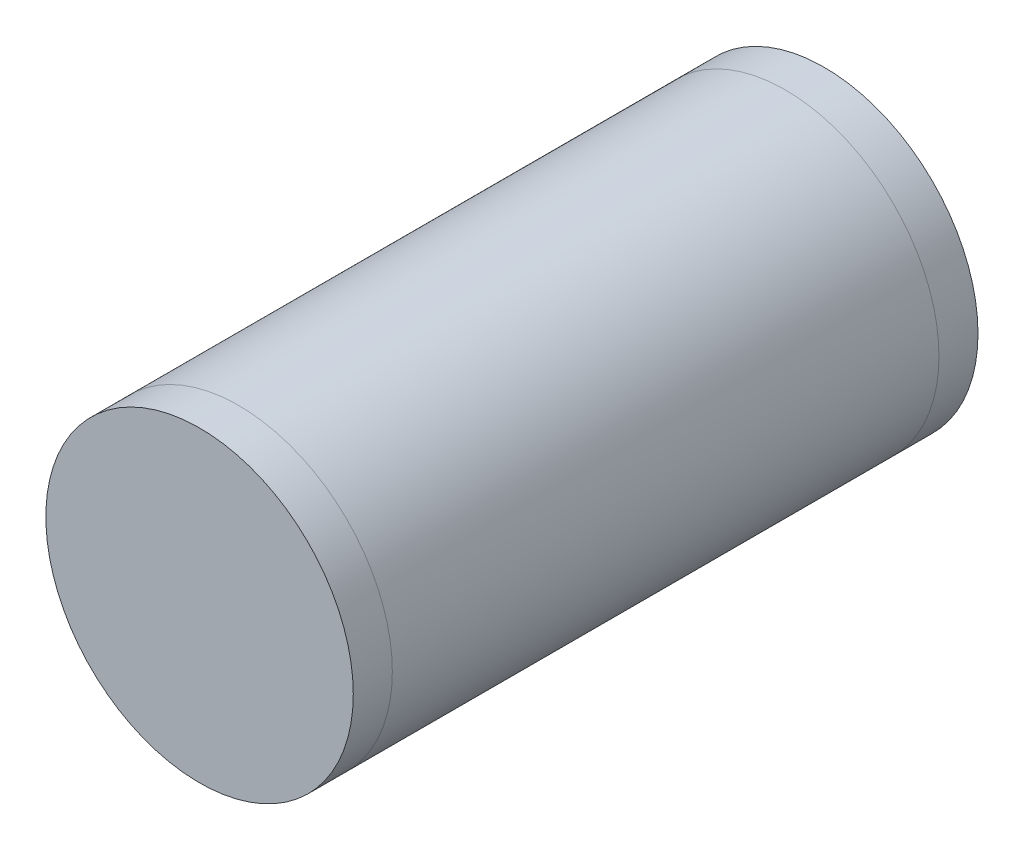
ISO-10303-21;
HEADER;
FILE_DESCRIPTION(('STEP AP214'),'2;1');
FILE_NAME('part.step','',(''),(''),'','','');
FILE_SCHEMA(('AUTOMOTIVE_DESIGN { 1 0 10303 214 1 1 1 1 }'));
ENDSEC;
DATA;
#1=APPLICATION_CONTEXT('core data for automotive mechanical design processes');
#2=APPLICATION_PROTOCOL_DEFINITION('international standard','automotive_design',2000,#1);
#3=PRODUCT_CONTEXT('',#1,'mechanical');
#4=PRODUCT('Part','Part','',(#3));
#5=PRODUCT_RELATED_PRODUCT_CATEGORY('part','',(#4));
#6=PRODUCT_DEFINITION_FORMATION('','',#4);
#7=PRODUCT_DEFINITION_CONTEXT('part definition',#1,'design');
#8=PRODUCT_DEFINITION('design','',#6,#7);
#9=PRODUCT_DEFINITION_SHAPE('','',#8);
#10=(LENGTH_UNIT() NAMED_UNIT(*) SI_UNIT(.MILLI.,.METRE.));
#11=(NAMED_UNIT(*) PLANE_ANGLE_UNIT() SI_UNIT($,.RADIAN.));
#12=(NAMED_UNIT(*) SI_UNIT($,.STERADIAN.) SOLID_ANGLE_UNIT());
#13=UNCERTAINTY_MEASURE_WITH_UNIT(LENGTH_MEASURE(1.E-05),#10,'distance_accuracy_value','');
#14=(GEOMETRIC_REPRESENTATION_CONTEXT(3) GLOBAL_UNCERTAINTY_ASSIGNED_CONTEXT((#13)) GLOBAL_UNIT_ASSIGNED_CONTEXT((#10,
#11,#12)) REPRESENTATION_CONTEXT('',''));
#15=CARTESIAN_POINT('',(0.,0.,0.));
#16=DIRECTION('',(0.,0.,1.));
#17=DIRECTION('',(1.,0.,0.));
#18=AXIS2_PLACEMENT_3D('',#15,#16,#17);
#19=CARTESIAN_POINT('',(0.,0.,-101.6));
#20=DIRECTION('',(0.,0.,1.));
#21=DIRECTION('',(-1.,0.,0.));
#22=AXIS2_PLACEMENT_3D('',#19,#20,#21);
#23=CYLINDRICAL_SURFACE('',#22,50.);
#24=CARTESIAN_POINT('',(0.,0.,-101.6));
#25=DIRECTION('',(0.,0.,1.));
#26=DIRECTION('',(1.,0.,0.));
#27=AXIS2_PLACEMENT_3D('',#24,#25,#26);
#28=CIRCLE('',#27,50.);
#29=CARTESIAN_POINT('',(50.,0.,-101.6));
#30=VERTEX_POINT('',#29);
#31=EDGE_CURVE('E11',#30,#30,#28,.T.);
#32=ORIENTED_EDGE('',*,*,#31,.T.);
#33=EDGE_LOOP('',(#32));
#34=FACE_BOUND('',#33,.T.);
#35=CARTESIAN_POINT('',(0.,0.,-88.9));
#36=DIRECTION('',(0.,0.,1.));
#37=DIRECTION('',(1.,0.,0.));
#38=AXIS2_PLACEMENT_3D('',#35,#36,#37);
#39=CIRCLE('',#38,50.);
#40=CARTESIAN_POINT('',(50.,0.,-88.9));
#41=VERTEX_POINT('',#40);
#42=EDGE_CURVE('E61',#41,#41,#39,.T.);
#43=ORIENTED_EDGE('',*,*,#42,.F.);
#44=EDGE_LOOP('',(#43));
#45=FACE_BOUND('',#44,.T.);
#46=ADVANCED_FACE('F58',(#34,#45),#23,.T.);
#47=CARTESIAN_POINT('',(0.,0.,-101.6));
#48=DIRECTION('',(0.,0.,-1.));
#49=DIRECTION('',(1.,0.,0.));
#50=AXIS2_PLACEMENT_3D('',#47,#48,#49);
#51=PLANE('',#50);
#52=ORIENTED_EDGE('',*,*,#31,.F.);
#53=EDGE_LOOP('',(#52));
#54=FACE_BOUND('',#53,.T.);
#55=ADVANCED_FACE('F73',(#54),#51,.T.);
#56=CARTESIAN_POINT('',(0.,0.,-88.9));
#57=DIRECTION('',(0.,0.,-1.));
#58=DIRECTION('',(1.,0.,0.));
#59=AXIS2_PLACEMENT_3D('',#56,#57,#58);
#60=PLANE('',#59);
#61=ORIENTED_EDGE('',*,*,#42,.T.);
#62=EDGE_LOOP('',(#61));
#63=FACE_BOUND('',#62,.T.);
#64=ADVANCED_FACE('F70',(#63),#60,.F.);
#65=CLOSED_SHELL('',(#46,#55,#64));
#66=MANIFOLD_SOLID_BREP('B2',#65);
#67=CARTESIAN_POINT('',(0.,0.,101.6));
#68=DIRECTION('',(0.,0.,-1.));
#69=DIRECTION('',(-1.,0.,0.));
#70=AXIS2_PLACEMENT_3D('',#67,#68,#69);
#71=CYLINDRICAL_SURFACE('',#70,50.);
#72=CARTESIAN_POINT('',(0.,0.,101.6));
#73=DIRECTION('',(0.,0.,1.));
#74=DIRECTION('',(1.,0.,0.));
#75=AXIS2_PLACEMENT_3D('',#72,#73,#74);
#76=CIRCLE('',#75,50.);
#77=CARTESIAN_POINT('',(50.,0.,101.6));
#78=VERTEX_POINT('',#77);
#79=EDGE_CURVE('E57',#78,#78,#76,.T.);
#80=ORIENTED_EDGE('',*,*,#79,.F.);
#81=EDGE_LOOP('',(#80));
#82=FACE_BOUND('',#81,.T.);
#83=CARTESIAN_POINT('',(0.,0.,88.9));
#84=DIRECTION('',(0.,0.,1.));
#85=DIRECTION('',(1.,0.,0.));
#86=AXIS2_PLACEMENT_3D('',#83,#84,#85);
#87=CIRCLE('',#86,50.);
#88=CARTESIAN_POINT('',(50.,0.,88.9));
#89=VERTEX_POINT('',#88);
#90=EDGE_CURVE('E127',#89,#89,#87,.T.);
#91=ORIENTED_EDGE('',*,*,#90,.T.);
#92=EDGE_LOOP('',(#91));
#93=FACE_BOUND('',#92,.T.);
#94=ADVANCED_FACE('F124',(#82,#93),#71,.T.);
#95=CARTESIAN_POINT('',(0.,0.,101.6));
#96=DIRECTION('',(0.,0.,1.));
#97=DIRECTION('',(1.,0.,0.));
#98=AXIS2_PLACEMENT_3D('',#95,#96,#97);
#99=PLANE('',#98);
#100=ORIENTED_EDGE('',*,*,#79,.T.);
#101=EDGE_LOOP('',(#100));
#102=FACE_BOUND('',#101,.T.);
#103=ADVANCED_FACE('F139',(#102),#99,.T.);
#104=CARTESIAN_POINT('',(0.,0.,88.9));
#105=DIRECTION('',(0.,0.,1.));
#106=DIRECTION('',(1.,0.,0.));
#107=AXIS2_PLACEMENT_3D('',#104,#105,#106);
#108=PLANE('',#107);
#109=ORIENTED_EDGE('',*,*,#90,.F.);
#110=EDGE_LOOP('',(#109));
#111=FACE_BOUND('',#110,.T.);
#112=ADVANCED_FACE('F137',(#111),#108,.F.);
#113=CLOSED_SHELL('',(#94,#103,#112));
#114=MANIFOLD_SOLID_BREP('B6',#113);
#115=CARTESIAN_POINT('',(0.,0.,88.9));
#116=DIRECTION('',(0.,0.,1.));
#117=DIRECTION('',(1.,0.,0.));
#118=AXIS2_PLACEMENT_3D('',#115,#116,#117);
#119=PLANE('',#118);
#120=CARTESIAN_POINT('',(0.,0.,88.9));
#121=DIRECTION('',(0.,0.,1.));
#122=DIRECTION('',(1.,0.,0.));
#123=AXIS2_PLACEMENT_3D('',#120,#121,#122);
#124=CIRCLE('',#123,50.);
#125=CARTESIAN_POINT('',(50.,0.,88.9));
#126=VERTEX_POINT('',#125);
#127=EDGE_CURVE('E123',#126,#126,#124,.T.);
#128=ORIENTED_EDGE('',*,*,#127,.T.);
#129=EDGE_LOOP('',(#128));
#130=FACE_BOUND('',#129,.T.);
#131=CARTESIAN_POINT('',(0.,0.,88.9));
#132=DIRECTION('',(0.,0.,1.));
#133=DIRECTION('',(1.,0.,0.));
#134=AXIS2_PLACEMENT_3D('',#131,#132,#133);
#135=CIRCLE('',#134,45.);
#136=CARTESIAN_POINT('',(45.,0.,88.9));
#137=VERTEX_POINT('',#136);
#138=EDGE_CURVE('E178',#137,#137,#135,.T.);
#139=ORIENTED_EDGE('',*,*,#138,.F.);
#140=EDGE_LOOP('',(#139));
#141=FACE_BOUND('',#140,.T.);
#142=ADVANCED_FACE('F165',(#130,#141),#119,.T.);
#143=CARTESIAN_POINT('',(0.,0.,-88.9));
#144=DIRECTION('',(0.,0.,1.));
#145=DIRECTION('',(1.,0.,0.));
#146=AXIS2_PLACEMENT_3D('',#143,#144,#145);
#147=PLANE('',#146);
#148=CARTESIAN_POINT('',(0.,0.,-88.9));
#149=DIRECTION('',(0.,0.,1.));
#150=DIRECTION('',(1.,0.,0.));
#151=AXIS2_PLACEMENT_3D('',#148,#149,#150);
#152=CIRCLE('',#151,50.);
#153=CARTESIAN_POINT('',(50.,0.,-88.9));
#154=VERTEX_POINT('',#153);
#155=EDGE_CURVE('E169',#154,#154,#152,.T.);
#156=ORIENTED_EDGE('',*,*,#155,.F.);
#157=EDGE_LOOP('',(#156));
#158=FACE_BOUND('',#157,.T.);
#159=CARTESIAN_POINT('',(0.,0.,-88.9));
#160=DIRECTION('',(0.,0.,1.));
#161=DIRECTION('',(1.,0.,0.));
#162=AXIS2_PLACEMENT_3D('',#159,#160,#161);
#163=CIRCLE('',#162,45.);
#164=CARTESIAN_POINT('',(45.,0.,-88.9));
#165=VERTEX_POINT('',#164);
#166=EDGE_CURVE('E180',#165,#165,#163,.T.);
#167=ORIENTED_EDGE('',*,*,#166,.T.);
#168=EDGE_LOOP('',(#167));
#169=FACE_BOUND('',#168,.T.);
#170=ADVANCED_FACE('F192',(#158,#169),#147,.F.);
#171=CARTESIAN_POINT('',(0.,0.,88.9));
#172=DIRECTION('',(0.,0.,-1.));
#173=DIRECTION('',(-1.,0.,0.));
#174=AXIS2_PLACEMENT_3D('',#171,#172,#173);
#175=CYLINDRICAL_SURFACE('',#174,50.);
#176=ORIENTED_EDGE('',*,*,#127,.F.);
#177=EDGE_LOOP('',(#176));
#178=FACE_BOUND('',#177,.T.);
#179=ORIENTED_EDGE('',*,*,#155,.T.);
#180=EDGE_LOOP('',(#179));
#181=FACE_BOUND('',#180,.T.);
#182=ADVANCED_FACE('F167',(#178,#181),#175,.T.);
#183=CARTESIAN_POINT('',(0.,0.,88.9));
#184=DIRECTION('',(0.,0.,-1.));
#185=DIRECTION('',(-1.,0.,0.));
#186=AXIS2_PLACEMENT_3D('',#183,#184,#185);
#187=CYLINDRICAL_SURFACE('',#186,45.);
#188=ORIENTED_EDGE('',*,*,#138,.T.);
#189=EDGE_LOOP('',(#188));
#190=FACE_BOUND('',#189,.T.);
#191=ORIENTED_EDGE('',*,*,#166,.F.);
#192=EDGE_LOOP('',(#191));
#193=FACE_BOUND('',#192,.T.);
#194=ADVANCED_FACE('F188',(#190,#193),#187,.F.);
#195=CLOSED_SHELL('',(#142,#170,#182,#194));
#196=MANIFOLD_SOLID_BREP('B52',#195);
#197=ADVANCED_BREP_SHAPE_REPRESENTATION('',(#18,#66,#114,#196),#14);
#198=SHAPE_DEFINITION_REPRESENTATION(#9,#197);
ENDSEC;
END-ISO-10303-21;
